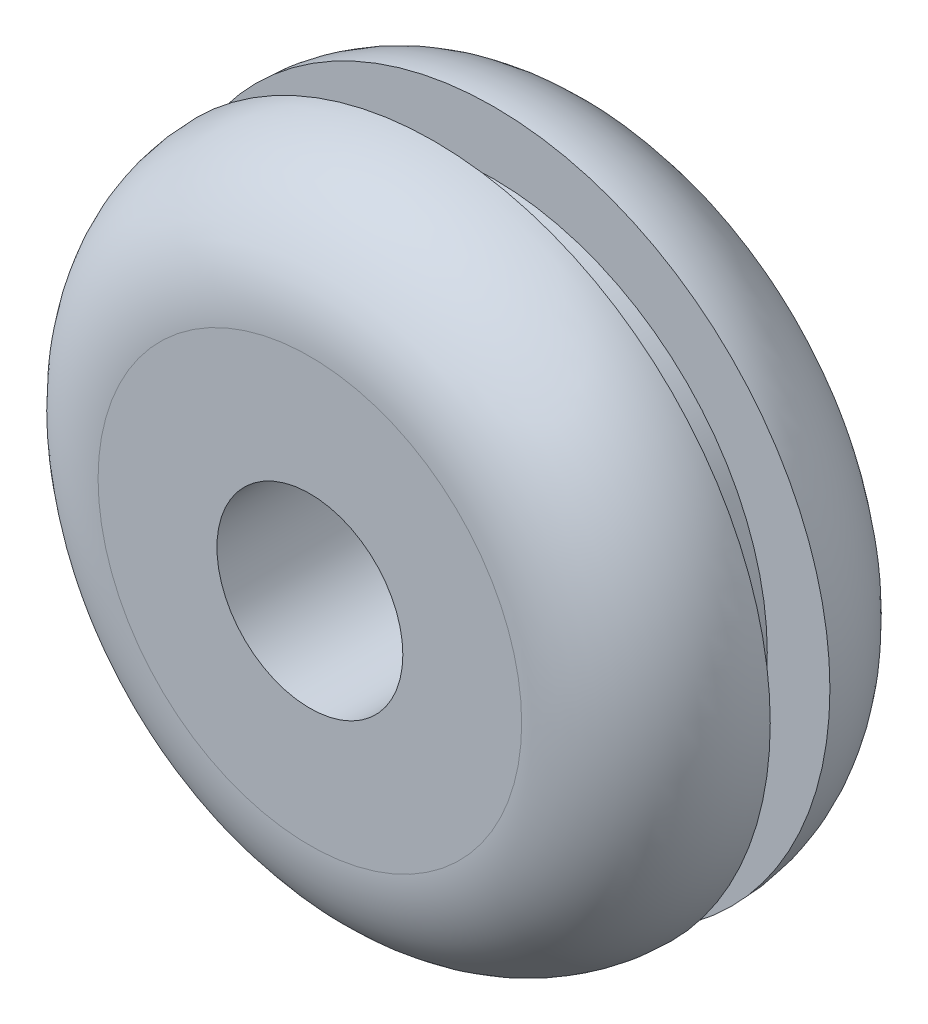
ISO-10303-21;
HEADER;
FILE_DESCRIPTION(('STEP AP214'),'2;1');
FILE_NAME('part.step','',(''),(''),'','','');
FILE_SCHEMA(('AUTOMOTIVE_DESIGN { 1 0 10303 214 1 1 1 1 }'));
ENDSEC;
DATA;
#1=APPLICATION_CONTEXT('core data for automotive mechanical design processes');
#2=APPLICATION_PROTOCOL_DEFINITION('international standard','automotive_design',2000,#1);
#3=PRODUCT_CONTEXT('',#1,'mechanical');
#4=PRODUCT('Part','Part','',(#3));
#5=PRODUCT_RELATED_PRODUCT_CATEGORY('part','',(#4));
#6=PRODUCT_DEFINITION_FORMATION('','',#4);
#7=PRODUCT_DEFINITION_CONTEXT('part definition',#1,'design');
#8=PRODUCT_DEFINITION('design','',#6,#7);
#9=PRODUCT_DEFINITION_SHAPE('','',#8);
#10=(LENGTH_UNIT() NAMED_UNIT(*) SI_UNIT(.MILLI.,.METRE.));
#11=(NAMED_UNIT(*) PLANE_ANGLE_UNIT() SI_UNIT($,.RADIAN.));
#12=(NAMED_UNIT(*) SI_UNIT($,.STERADIAN.) SOLID_ANGLE_UNIT());
#13=UNCERTAINTY_MEASURE_WITH_UNIT(LENGTH_MEASURE(1.E-05),#10,'distance_accuracy_value','');
#14=(GEOMETRIC_REPRESENTATION_CONTEXT(3) GLOBAL_UNCERTAINTY_ASSIGNED_CONTEXT((#13)) GLOBAL_UNIT_ASSIGNED_CONTEXT((#10,
#11,#12)) REPRESENTATION_CONTEXT('',''));
#15=CARTESIAN_POINT('',(0.,0.,0.));
#16=DIRECTION('',(0.,0.,1.));
#17=DIRECTION('',(1.,0.,0.));
#18=AXIS2_PLACEMENT_3D('',#15,#16,#17);
#19=CARTESIAN_POINT('',(0.,0.,0.762));
#20=DIRECTION('',(0.,0.,-1.));
#21=DIRECTION('',(-1.,0.,0.));
#22=AXIS2_PLACEMENT_3D('',#19,#20,#21);
#23=CYLINDRICAL_SURFACE('',#22,6.985);
#24=CARTESIAN_POINT('',(0.,0.,0.762));
#25=DIRECTION('',(0.,0.,1.));
#26=DIRECTION('',(1.,0.,0.));
#27=AXIS2_PLACEMENT_3D('',#24,#25,#26);
#28=CIRCLE('',#27,6.985);
#29=CARTESIAN_POINT('',(-6.985,0.,0.762));
#30=VERTEX_POINT('',#29);
#31=EDGE_CURVE('E43',#30,#30,#28,.T.);
#32=CARTESIAN_POINT('',(0.,0.,-0.762));
#33=DIRECTION('',(0.,0.,-1.));
#34=DIRECTION('',(-1.,0.,0.));
#35=AXIS2_PLACEMENT_3D('',#32,#33,#34);
#36=CIRCLE('',#35,6.985);
#37=CARTESIAN_POINT('',(-6.985,0.,-0.762));
#38=VERTEX_POINT('',#37);
#39=EDGE_CURVE('E52',#38,#38,#36,.T.);
#40=CARTESIAN_POINT('',(-6.985,0.,0.762));
#41=CARTESIAN_POINT('',(-6.985,0.,0.746125));
#42=CARTESIAN_POINT('',(-6.985,0.,0.73025));
#43=CARTESIAN_POINT('',(-6.985,0.,0.6985));
#44=CARTESIAN_POINT('',(-6.985,0.,0.682625));
#45=CARTESIAN_POINT('',(-6.985,0.,0.650875));
#46=CARTESIAN_POINT('',(-6.985,0.,0.635));
#47=CARTESIAN_POINT('',(-6.985,0.,0.60325));
#48=CARTESIAN_POINT('',(-6.985,0.,0.587375));
#49=CARTESIAN_POINT('',(-6.985,0.,0.555625));
#50=CARTESIAN_POINT('',(-6.985,0.,0.53975));
#51=CARTESIAN_POINT('',(-6.985,0.,0.508));
#52=CARTESIAN_POINT('',(-6.985,0.,0.492125));
#53=CARTESIAN_POINT('',(-6.985,0.,0.460375));
#54=CARTESIAN_POINT('',(-6.985,0.,0.4445));
#55=CARTESIAN_POINT('',(-6.985,0.,0.41275));
#56=CARTESIAN_POINT('',(-6.985,0.,0.396875));
#57=CARTESIAN_POINT('',(-6.985,0.,0.365125));
#58=CARTESIAN_POINT('',(-6.985,0.,0.34925));
#59=CARTESIAN_POINT('',(-6.985,0.,0.3175));
#60=CARTESIAN_POINT('',(-6.985,0.,0.301625));
#61=CARTESIAN_POINT('',(-6.985,0.,0.269875));
#62=CARTESIAN_POINT('',(-6.985,0.,0.254));
#63=CARTESIAN_POINT('',(-6.985,0.,0.22225));
#64=CARTESIAN_POINT('',(-6.985,0.,0.206375));
#65=CARTESIAN_POINT('',(-6.985,0.,0.174625));
#66=CARTESIAN_POINT('',(-6.985,0.,0.15875));
#67=CARTESIAN_POINT('',(-6.985,0.,0.127));
#68=CARTESIAN_POINT('',(-6.985,0.,0.111125));
#69=CARTESIAN_POINT('',(-6.985,0.,0.0793749999999999));
#70=CARTESIAN_POINT('',(-6.985,0.,0.0634999999999999));
#71=CARTESIAN_POINT('',(-6.985,0.,0.0317499999999999));
#72=CARTESIAN_POINT('',(-6.985,0.,0.0158749999999999));
#73=CARTESIAN_POINT('',(-6.985,0.,-0.0158750000000001));
#74=CARTESIAN_POINT('',(-6.985,0.,-0.0317500000000001));
#75=CARTESIAN_POINT('',(-6.985,0.,-0.0635000000000002));
#76=CARTESIAN_POINT('',(-6.985,0.,-0.0793750000000002));
#77=CARTESIAN_POINT('',(-6.985,0.,-0.111125));
#78=CARTESIAN_POINT('',(-6.985,0.,-0.127));
#79=CARTESIAN_POINT('',(-6.985,0.,-0.15875));
#80=CARTESIAN_POINT('',(-6.985,0.,-0.174625));
#81=CARTESIAN_POINT('',(-6.985,0.,-0.206375));
#82=CARTESIAN_POINT('',(-6.985,0.,-0.22225));
#83=CARTESIAN_POINT('',(-6.985,0.,-0.254));
#84=CARTESIAN_POINT('',(-6.985,0.,-0.269875));
#85=CARTESIAN_POINT('',(-6.985,0.,-0.301625));
#86=CARTESIAN_POINT('',(-6.985,0.,-0.3175));
#87=CARTESIAN_POINT('',(-6.985,0.,-0.34925));
#88=CARTESIAN_POINT('',(-6.985,0.,-0.365125));
#89=CARTESIAN_POINT('',(-6.985,0.,-0.396875));
#90=CARTESIAN_POINT('',(-6.985,0.,-0.41275));
#91=CARTESIAN_POINT('',(-6.985,0.,-0.4445));
#92=CARTESIAN_POINT('',(-6.985,0.,-0.460375));
#93=CARTESIAN_POINT('',(-6.985,0.,-0.492125));
#94=CARTESIAN_POINT('',(-6.985,0.,-0.508));
#95=CARTESIAN_POINT('',(-6.985,0.,-0.53975));
#96=CARTESIAN_POINT('',(-6.985,0.,-0.555625));
#97=CARTESIAN_POINT('',(-6.985,0.,-0.587375));
#98=CARTESIAN_POINT('',(-6.985,0.,-0.60325));
#99=CARTESIAN_POINT('',(-6.985,0.,-0.635));
#100=CARTESIAN_POINT('',(-6.985,0.,-0.650875));
#101=CARTESIAN_POINT('',(-6.985,0.,-0.682625));
#102=CARTESIAN_POINT('',(-6.985,0.,-0.6985));
#103=CARTESIAN_POINT('',(-6.985,0.,-0.73025));
#104=CARTESIAN_POINT('',(-6.985,0.,-0.746125));
#105=CARTESIAN_POINT('',(-6.985,0.,-0.762));
#106=B_SPLINE_CURVE_WITH_KNOTS('',3,(#40,#41,#42,#43,#44,#45,#46,#47,#48,#49,#50,#51,#52,#53,
#54,#55,#56,#57,#58,#59,#60,#61,#62,#63,#64,#65,#66,#67,#68,#69,#70,#71,#72,#73,#74,#75,#76,#77,
#78,#79,#80,#81,#82,#83,#84,#85,#86,#87,#88,#89,#90,#91,#92,#93,#94,#95,#96,#97,#98,#99,#100,
#101,#102,#103,#104,#105),.UNSPECIFIED.,.F.,.F.,(4,2,2,2,2,2,2,2,2,2,2,2,2,2,2,2,2,2,2,2,2,2,2,
2,2,2,2,2,2,2,2,2,4),(0.,0.0476249999999999,0.09525,0.142875,0.1905,0.238125,0.28575,0.333375,
0.381,0.428625,0.47625,0.523875,0.5715,0.619125,0.66675,0.714375,0.762,0.809625,0.85725,
0.904875,0.9525,1.000125,1.04775,1.095375,1.143,1.190625,1.23825,1.285875,1.3335,1.381125,
1.42875,1.476375,1.524),.UNSPECIFIED.);
#107=EDGE_CURVE('BSEAM32',#30,#38,#106,.T.);
#108=ORIENTED_EDGE('',*,*,#31,.F.);
#109=ORIENTED_EDGE('',*,*,#39,.F.);
#110=ORIENTED_EDGE('',*,*,#107,.T.);
#111=ORIENTED_EDGE('',*,*,#107,.F.);
#112=EDGE_LOOP('',(#108,#110,#109,#111));
#113=FACE_BOUND('',#112,.T.);
#114=ADVANCED_FACE('F32',(#113),#23,.T.);
#115=CARTESIAN_POINT('',(0.,0.,0.762));
#116=DIRECTION('',(0.,0.,1.));
#117=DIRECTION('',(1.,0.,0.));
#118=AXIS2_PLACEMENT_3D('',#115,#116,#117);
#119=PLANE('',#118);
#120=CARTESIAN_POINT('',(0.,0.,0.762));
#121=DIRECTION('',(0.,0.,1.));
#122=DIRECTION('',(1.,0.,0.));
#123=AXIS2_PLACEMENT_3D('',#120,#121,#122);
#124=CIRCLE('',#123,8.5852);
#125=CARTESIAN_POINT('',(8.5852,0.,0.762));
#126=VERTEX_POINT('',#125);
#127=EDGE_CURVE('E47',#126,#126,#124,.T.);
#128=ORIENTED_EDGE('',*,*,#127,.F.);
#129=EDGE_LOOP('',(#128));
#130=FACE_BOUND('',#129,.T.);
#131=ORIENTED_EDGE('',*,*,#31,.T.);
#132=EDGE_LOOP('',(#131));
#133=FACE_BOUND('',#132,.T.);
#134=ADVANCED_FACE('F76',(#130,#133),#119,.F.);
#135=CARTESIAN_POINT('',(0.,0.,3.937));
#136=DIRECTION('',(0.,0.,1.));
#137=DIRECTION('',(1.,0.,0.));
#138=AXIS2_PLACEMENT_3D('',#135,#136,#137);
#139=PLANE('',#138);
#140=CARTESIAN_POINT('',(0.,0.,3.937));
#141=DIRECTION('',(0.,0.,1.));
#142=DIRECTION('',(1.,0.,0.));
#143=AXIS2_PLACEMENT_3D('',#140,#141,#142);
#144=CIRCLE('',#143,2.3749);
#145=CARTESIAN_POINT('',(2.3749,0.,3.937));
#146=VERTEX_POINT('',#145);
#147=EDGE_CURVE('E59',#146,#146,#144,.T.);
#148=ORIENTED_EDGE('',*,*,#147,.F.);
#149=EDGE_LOOP('',(#148));
#150=FACE_BOUND('',#149,.T.);
#151=CARTESIAN_POINT('',(0.,0.,3.937));
#152=DIRECTION('',(0.,0.,1.));
#153=DIRECTION('',(1.,0.,0.));
#154=AXIS2_PLACEMENT_3D('',#151,#152,#153);
#155=CIRCLE('',#154,5.4102);
#156=CARTESIAN_POINT('',(5.4102,0.,3.937));
#157=VERTEX_POINT('',#156);
#158=EDGE_CURVE('E39',#157,#157,#155,.T.);
#159=ORIENTED_EDGE('',*,*,#158,.T.);
#160=EDGE_LOOP('',(#159));
#161=FACE_BOUND('',#160,.T.);
#162=ADVANCED_FACE('F73',(#150,#161),#139,.T.);
#163=CARTESIAN_POINT('',(0.,0.,0.762));
#164=DIRECTION('',(0.,0.,1.));
#165=DIRECTION('',(1.,0.,0.));
#166=AXIS2_PLACEMENT_3D('',#163,#164,#165);
#167=TOROIDAL_SURFACE('',#166,5.4102,3.175);
#168=ORIENTED_EDGE('',*,*,#127,.T.);
#169=EDGE_LOOP('',(#168));
#170=FACE_BOUND('',#169,.T.);
#171=ORIENTED_EDGE('',*,*,#158,.F.);
#172=EDGE_LOOP('',(#171));
#173=FACE_BOUND('',#172,.T.);
#174=ADVANCED_FACE('F75',(#170,#173),#167,.T.);
#175=CARTESIAN_POINT('',(0.,0.,-0.762));
#176=DIRECTION('',(0.,0.,-1.));
#177=DIRECTION('',(1.,0.,0.));
#178=AXIS2_PLACEMENT_3D('',#175,#176,#177);
#179=PLANE('',#178);
#180=CARTESIAN_POINT('',(0.,0.,-0.762));
#181=DIRECTION('',(0.,0.,1.));
#182=DIRECTION('',(1.,0.,0.));
#183=AXIS2_PLACEMENT_3D('',#180,#181,#182);
#184=CIRCLE('',#183,8.5852);
#185=CARTESIAN_POINT('',(8.5852,0.,-0.762));
#186=VERTEX_POINT('',#185);
#187=EDGE_CURVE('E55',#186,#186,#184,.T.);
#188=ORIENTED_EDGE('',*,*,#187,.T.);
#189=EDGE_LOOP('',(#188));
#190=FACE_BOUND('',#189,.T.);
#191=ORIENTED_EDGE('',*,*,#39,.T.);
#192=EDGE_LOOP('',(#191));
#193=FACE_BOUND('',#192,.T.);
#194=ADVANCED_FACE('F82',(#190,#193),#179,.F.);
#195=CARTESIAN_POINT('',(0.,0.,-3.937));
#196=DIRECTION('',(0.,0.,-1.));
#197=DIRECTION('',(1.,0.,0.));
#198=AXIS2_PLACEMENT_3D('',#195,#196,#197);
#199=PLANE('',#198);
#200=CARTESIAN_POINT('',(0.,0.,-3.937));
#201=DIRECTION('',(0.,0.,1.));
#202=DIRECTION('',(1.,0.,0.));
#203=AXIS2_PLACEMENT_3D('',#200,#201,#202);
#204=CIRCLE('',#203,2.3749);
#205=CARTESIAN_POINT('',(2.3749,0.,-3.937));
#206=VERTEX_POINT('',#205);
#207=EDGE_CURVE('E58',#206,#206,#204,.T.);
#208=ORIENTED_EDGE('',*,*,#207,.T.);
#209=EDGE_LOOP('',(#208));
#210=FACE_BOUND('',#209,.T.);
#211=CARTESIAN_POINT('',(0.,0.,-3.937));
#212=DIRECTION('',(0.,0.,-1.));
#213=DIRECTION('',(-1.,0.,0.));
#214=AXIS2_PLACEMENT_3D('',#211,#212,#213);
#215=CIRCLE('',#214,5.4102);
#216=CARTESIAN_POINT('',(-5.4102,0.,-3.937));
#217=VERTEX_POINT('',#216);
#218=EDGE_CURVE('E10',#217,#217,#215,.T.);
#219=ORIENTED_EDGE('',*,*,#218,.T.);
#220=EDGE_LOOP('',(#219));
#221=FACE_BOUND('',#220,.T.);
#222=ADVANCED_FACE('F65',(#210,#221),#199,.T.);
#223=CARTESIAN_POINT('',(0.,0.,-0.762));
#224=DIRECTION('',(0.,0.,-1.));
#225=DIRECTION('',(-1.,0.,0.));
#226=AXIS2_PLACEMENT_3D('',#223,#224,#225);
#227=TOROIDAL_SURFACE('',#226,5.4102,3.175);
#228=ORIENTED_EDGE('',*,*,#218,.F.);
#229=EDGE_LOOP('',(#228));
#230=FACE_BOUND('',#229,.T.);
#231=ORIENTED_EDGE('',*,*,#187,.F.);
#232=EDGE_LOOP('',(#231));
#233=FACE_BOUND('',#232,.T.);
#234=ADVANCED_FACE('F34',(#230,#233),#227,.T.);
#235=CARTESIAN_POINT('',(0.,0.,-3.937));
#236=DIRECTION('',(0.,0.,1.));
#237=DIRECTION('',(1.,0.,0.));
#238=AXIS2_PLACEMENT_3D('',#235,#236,#237);
#239=CYLINDRICAL_SURFACE('',#238,2.3749);
#240=ORIENTED_EDGE('',*,*,#207,.F.);
#241=EDGE_LOOP('',(#240));
#242=FACE_BOUND('',#241,.T.);
#243=ORIENTED_EDGE('',*,*,#147,.T.);
#244=EDGE_LOOP('',(#243));
#245=FACE_BOUND('',#244,.T.);
#246=ADVANCED_FACE('F67',(#242,#245),#239,.F.);
#247=CLOSED_SHELL('',(#114,#134,#162,#174,#194,#222,#234,#246));
#248=MANIFOLD_SOLID_BREP('B2',#247);
#249=ADVANCED_BREP_SHAPE_REPRESENTATION('',(#18,#248),#14);
#250=SHAPE_DEFINITION_REPRESENTATION(#9,#249);
ENDSEC;
END-ISO-10303-21;
